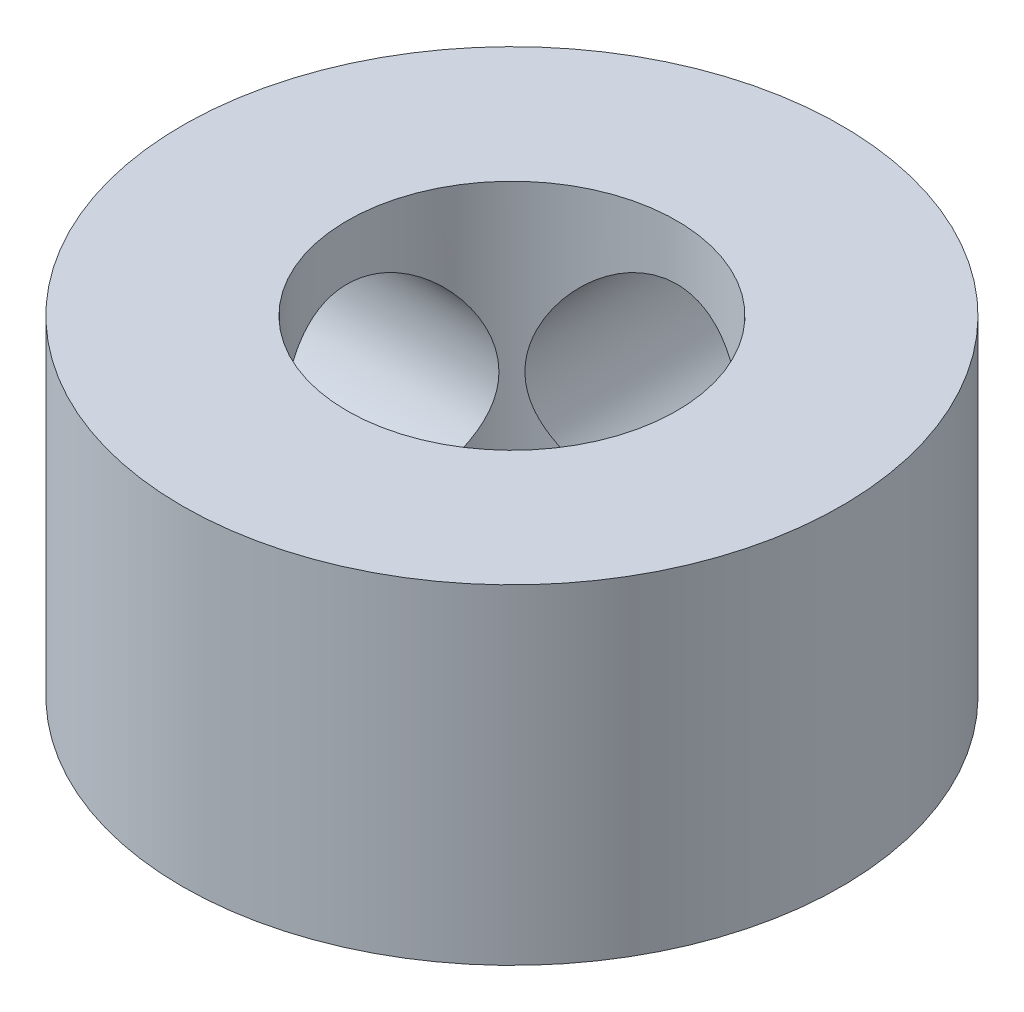
ISO-10303-21;
HEADER;
FILE_DESCRIPTION(('STEP AP214'),'2;1');
FILE_NAME('part.step','',(''),(''),'','','');
FILE_SCHEMA(('AUTOMOTIVE_DESIGN { 1 0 10303 214 1 1 1 1 }'));
ENDSEC;
DATA;
#1=APPLICATION_CONTEXT('core data for automotive mechanical design processes');
#2=APPLICATION_PROTOCOL_DEFINITION('international standard','automotive_design',2000,#1);
#3=PRODUCT_CONTEXT('',#1,'mechanical');
#4=PRODUCT('Part','Part','',(#3));
#5=PRODUCT_RELATED_PRODUCT_CATEGORY('part','',(#4));
#6=PRODUCT_DEFINITION_FORMATION('','',#4);
#7=PRODUCT_DEFINITION_CONTEXT('part definition',#1,'design');
#8=PRODUCT_DEFINITION('design','',#6,#7);
#9=PRODUCT_DEFINITION_SHAPE('','',#8);
#10=(LENGTH_UNIT() NAMED_UNIT(*) SI_UNIT(.MILLI.,.METRE.));
#11=(NAMED_UNIT(*) PLANE_ANGLE_UNIT() SI_UNIT($,.RADIAN.));
#12=(NAMED_UNIT(*) SI_UNIT($,.STERADIAN.) SOLID_ANGLE_UNIT());
#13=UNCERTAINTY_MEASURE_WITH_UNIT(LENGTH_MEASURE(1.E-05),#10,'distance_accuracy_value','');
#14=(GEOMETRIC_REPRESENTATION_CONTEXT(3) GLOBAL_UNCERTAINTY_ASSIGNED_CONTEXT((#13)) GLOBAL_UNIT_ASSIGNED_CONTEXT((#10,
#11,#12)) REPRESENTATION_CONTEXT('',''));
#15=CARTESIAN_POINT('',(0.,0.,0.));
#16=DIRECTION('',(0.,0.,1.));
#17=DIRECTION('',(1.,0.,0.));
#18=AXIS2_PLACEMENT_3D('',#15,#16,#17);
#19=CARTESIAN_POINT('',(0.,6.,0.));
#20=DIRECTION('',(0.,1.,0.));
#21=DIRECTION('',(0.,0.,1.));
#22=AXIS2_PLACEMENT_3D('',#19,#20,#21);
#23=PLANE('',#22);
#24=CARTESIAN_POINT('',(0.,6.,0.));
#25=DIRECTION('',(0.,1.,0.));
#26=DIRECTION('',(0.,0.,1.));
#27=AXIS2_PLACEMENT_3D('',#24,#25,#26);
#28=CIRCLE('',#27,6.);
#29=CARTESIAN_POINT('',(0.,6.,6.));
#30=VERTEX_POINT('',#29);
#31=EDGE_CURVE('E10',#30,#30,#28,.T.);
#32=ORIENTED_EDGE('',*,*,#31,.T.);
#33=EDGE_LOOP('',(#32));
#34=FACE_BOUND('',#33,.T.);
#35=CARTESIAN_POINT('',(0.,6.,0.));
#36=DIRECTION('',(0.,1.,0.));
#37=DIRECTION('',(0.,0.,1.));
#38=AXIS2_PLACEMENT_3D('',#35,#36,#37);
#39=CIRCLE('',#38,3.);
#40=CARTESIAN_POINT('',(0.,6.,3.));
#41=VERTEX_POINT('',#40);
#42=EDGE_CURVE('E60',#41,#41,#39,.T.);
#43=ORIENTED_EDGE('',*,*,#42,.F.);
#44=EDGE_LOOP('',(#43));
#45=FACE_BOUND('',#44,.T.);
#46=ADVANCED_FACE('F36',(#34,#45),#23,.T.);
#47=CARTESIAN_POINT('',(0.,0.,0.));
#48=DIRECTION('',(0.,1.,0.));
#49=DIRECTION('',(0.,0.,1.));
#50=AXIS2_PLACEMENT_3D('',#47,#48,#49);
#51=PLANE('',#50);
#52=CARTESIAN_POINT('',(0.,0.,0.));
#53=DIRECTION('',(0.,1.,0.));
#54=DIRECTION('',(0.,0.,1.));
#55=AXIS2_PLACEMENT_3D('',#52,#53,#54);
#56=CIRCLE('',#55,6.);
#57=CARTESIAN_POINT('',(0.,0.,6.));
#58=VERTEX_POINT('',#57);
#59=EDGE_CURVE('E55',#58,#58,#56,.T.);
#60=ORIENTED_EDGE('',*,*,#59,.F.);
#61=EDGE_LOOP('',(#60));
#62=FACE_BOUND('',#61,.T.);
#63=CARTESIAN_POINT('',(0.,0.,0.));
#64=DIRECTION('',(0.,1.,0.));
#65=DIRECTION('',(0.,0.,1.));
#66=AXIS2_PLACEMENT_3D('',#63,#64,#65);
#67=CIRCLE('',#66,3.);
#68=CARTESIAN_POINT('',(0.,0.,3.));
#69=VERTEX_POINT('',#68);
#70=EDGE_CURVE('E58',#69,#69,#67,.T.);
#71=ORIENTED_EDGE('',*,*,#70,.T.);
#72=EDGE_LOOP('',(#71));
#73=FACE_BOUND('',#72,.T.);
#74=ADVANCED_FACE('F92',(#62,#73),#51,.F.);
#75=CARTESIAN_POINT('',(0.,6.,0.));
#76=DIRECTION('',(0.,-1.,0.));
#77=DIRECTION('',(0.,0.,-1.));
#78=AXIS2_PLACEMENT_3D('',#75,#76,#77);
#79=CYLINDRICAL_SURFACE('',#78,6.);
#80=CARTESIAN_POINT('',(-5.65685424949238,3.,-2.));
#81=CARTESIAN_POINT('',(-5.65685389060868,3.10893634967214,-2.00000051589543));
#82=CARTESIAN_POINT('',(-5.66003538581715,3.21786959964719,-1.99106956737105));
#83=CARTESIAN_POINT('',(-5.6723514816251,3.4325088419885,-1.95570226337762));
#84=CARTESIAN_POINT('',(-5.68148706284377,3.53821429974494,-1.92926302433679));
#85=CARTESIAN_POINT('',(-5.70456407377583,3.74325378599458,-1.85991097136981));
#86=CARTESIAN_POINT('',(-5.71849607942644,3.84259985888543,-1.81703044280649));
#87=CARTESIAN_POINT('',(-5.74958244020649,4.03272009709592,-1.71612325688276));
#88=CARTESIAN_POINT('',(-5.76673750607225,4.12349236510726,-1.65809325772037));
#89=CARTESIAN_POINT('',(-5.80308978814946,4.29743992467663,-1.52610229288576));
#90=CARTESIAN_POINT('',(-5.82233789689288,4.38023085734345,-1.45164868275584));
#91=CARTESIAN_POINT('',(-5.86027729602006,4.53241360244928,-1.28997533442879));
#92=CARTESIAN_POINT('',(-5.87896849657923,4.60180326316474,-1.20275355010475));
#93=CARTESIAN_POINT('',(-5.91427733843598,4.72695779465919,-1.01520901593002));
#94=CARTESIAN_POINT('',(-5.93082815403211,4.78231994123592,-0.914603822449052));
#95=CARTESIAN_POINT('',(-5.95939173541966,4.87518317025502,-0.704862445974949));
#96=CARTESIAN_POINT('',(-5.97140572406004,4.91268906635381,-0.595728571374425));
#97=CARTESIAN_POINT('',(-5.98918150863813,4.96747170926479,-0.37605763486699));
#98=CARTESIAN_POINT('',(-5.99514629555118,4.98540689251401,-0.265701509705938));
#99=CARTESIAN_POINT('',(-6.00087216436496,5.00263258672132,-0.0433957496481797));
#100=CARTESIAN_POINT('',(-6.00063484525791,5.00192790330482,0.0685534670877919));
#101=CARTESIAN_POINT('',(-5.99412079237463,4.98231149086794,0.286207030387629));
#102=CARTESIAN_POINT('',(-5.98808129510235,4.96411494305102,0.391984097183312));
#103=CARTESIAN_POINT('',(-5.97093934679463,4.91121403803905,0.598886877644343));
#104=CARTESIAN_POINT('',(-5.95983655262364,4.87650856204035,0.700012275558431));
#105=CARTESIAN_POINT('',(-5.93351340586449,4.79115736538788,0.896304949683945));
#106=CARTESIAN_POINT('',(-5.91824085048031,4.74030812290698,0.991376441937689));
#107=CARTESIAN_POINT('',(-5.88516786077838,4.62428058910269,1.17184865105464));
#108=CARTESIAN_POINT('',(-5.86736672402934,4.55909831334474,1.25724666877068));
#109=CARTESIAN_POINT('',(-5.83012383699793,4.4126512130806,1.42020173310261));
#110=CARTESIAN_POINT('',(-5.81064430337755,4.33077368431704,1.49720031413054));
#111=CARTESIAN_POINT('',(-5.77294670497801,4.15510254854676,1.63655451919635));
#112=CARTESIAN_POINT('',(-5.75472883491231,4.06130710854391,1.69890788656309));
#113=CARTESIAN_POINT('',(-5.72141050242225,3.86269274879312,1.80797491007149));
#114=CARTESIAN_POINT('',(-5.70635818569496,3.75773573736445,1.85445292724268));
#115=CARTESIAN_POINT('',(-5.6816330164877,3.54085721157117,1.92888638653867));
#116=CARTESIAN_POINT('',(-5.67195790974185,3.42893863758751,1.95684959149499));
#117=CARTESIAN_POINT('',(-5.6595927263117,3.20672328917685,1.99232256419504));
#118=CARTESIAN_POINT('',(-5.65660720637512,3.09658115050269,2.00069819101526));
#119=CARTESIAN_POINT('',(-5.65713344118369,2.87644770177179,1.99921087781944));
#120=CARTESIAN_POINT('',(-5.66064401583629,2.76645636795202,1.98935125045353));
#121=CARTESIAN_POINT('',(-5.67347236180599,2.55368606857618,1.95245130310462));
#122=CARTESIAN_POINT('',(-5.68258650881681,2.45078913969832,1.92601278796137));
#123=CARTESIAN_POINT('',(-5.70537107342046,2.25091278752163,1.85742772512093));
#124=CARTESIAN_POINT('',(-5.71904229869679,2.15393441681844,1.81527839272684));
#125=CARTESIAN_POINT('',(-5.74993755191574,1.965239158306,1.71494868147787));
#126=CARTESIAN_POINT('',(-5.76726051331257,1.8737867147164,1.65630223671699));
#127=CARTESIAN_POINT('',(-5.8033153746193,1.70170789523256,1.52517126111512));
#128=CARTESIAN_POINT('',(-5.82204768887589,1.62108472267756,1.45268265099756));
#129=CARTESIAN_POINT('',(-5.85990077275698,1.46894403181872,1.29178341180065));
#130=CARTESIAN_POINT('',(-5.87899687155793,1.3980512199623,1.2027745410933));
#131=CARTESIAN_POINT('',(-5.91453703226218,1.27216771530391,1.01365458280051));
#132=CARTESIAN_POINT('',(-5.9309811883539,1.21717645767515,0.913543889729105));
#133=CARTESIAN_POINT('',(-5.95928811621206,1.12515979027657,0.705559724864591));
#134=CARTESIAN_POINT('',(-5.97118060009062,1.08801744570387,0.597742246642393));
#135=CARTESIAN_POINT('',(-5.98917221675549,1.03254451587979,0.376916931692033));
#136=CARTESIAN_POINT('',(-5.99527344068038,1.01420714023899,0.263910983907779));
#137=CARTESIAN_POINT('',(-6.00083726472513,0.997475844788715,0.0416306717200819));
#138=CARTESIAN_POINT('',(-6.00059840178878,0.998185092135245,-0.067569447840037));
#139=CARTESIAN_POINT('',(-5.99424393038796,1.01731461629282,-0.284222290000348));
#140=CARTESIAN_POINT('',(-5.98812879867152,1.03573345630554,-0.391675153638113));
#141=CARTESIAN_POINT('',(-5.97081829908825,1.08916446915192,-0.600084238864118));
#142=CARTESIAN_POINT('',(-5.95970516722297,1.12390843070587,-0.701116541825578));
#143=CARTESIAN_POINT('',(-5.9335432140899,1.20875506219431,-0.895956701879591));
#144=CARTESIAN_POINT('',(-5.91849368096033,1.25886051039403,-0.989763248284865));
#145=CARTESIAN_POINT('',(-5.88531737655762,1.37513902420401,-1.17126803261757));
#146=CARTESIAN_POINT('',(-5.86709744983853,1.44183737076328,-1.25861250311521));
#147=CARTESIAN_POINT('',(-5.82985977583759,1.58851478231239,-1.42116205254485));
#148=CARTESIAN_POINT('',(-5.81084177546194,1.66849808452545,-1.49636324324918));
#149=CARTESIAN_POINT('',(-5.77326559651196,1.8432187111739,-1.63548361766624));
#150=CARTESIAN_POINT('',(-5.75475455977261,1.93841102195328,-1.6988459319958));
#151=CARTESIAN_POINT('',(-5.72120386646031,2.13866885380556,-1.80862868660223));
#152=CARTESIAN_POINT('',(-5.70616330322499,2.24373178605933,-1.85505355363895));
#153=CARTESIAN_POINT('',(-5.68202668413029,2.45592364803126,-1.92768765640833));
#154=CARTESIAN_POINT('',(-5.67269265714365,2.56274452705073,-1.95471581829904));
#155=CARTESIAN_POINT('',(-5.66010767079037,2.7797121009334,-1.99086864029853));
#156=CARTESIAN_POINT('',(-5.65685461234922,2.88985763482142,-1.99999947839319));
#157=CARTESIAN_POINT('',(-5.65685424949238,3.,-2.));
#158=B_SPLINE_CURVE_WITH_KNOTS('',3,(#80,#81,#82,#83,#84,#85,#86,#87,#88,#89,#90,#91,#92,#93,
#94,#95,#96,#97,#98,#99,#100,#101,#102,#103,#104,#105,#106,#107,#108,#109,#110,#111,#112,#113,
#114,#115,#116,#117,#118,#119,#120,#121,#122,#123,#124,#125,#126,#127,#128,#129,#130,#131,#132,
#133,#134,#135,#136,#137,#138,#139,#140,#141,#142,#143,#144,#145,#146,#147,#148,#149,#150,#151,
#152,#153,#154,#155,#156,#157),.UNSPECIFIED.,.T.,.F.,(4,2,2,2,2,2,2,2,2,2,2,2,2,2,2,2,2,2,2,2,2,
2,2,2,2,2,2,2,2,2,2,2,2,2,2,2,2,2,4),(0.,0.326401169598712,0.652856110030327,0.978673255001655,
1.30456233237088,1.64202674855136,1.97954530343976,2.32587012287314,2.67210152773578,
3.00628637529868,3.34038506604655,3.66138009651138,3.98239688378473,4.3076330972067,
4.63295983748044,4.97360348727835,5.31429959224212,5.65985279686111,6.00526102713231,
6.33508582728879,6.66485071674467,6.98328791537552,7.30178158293891,7.6303771547143,
7.95906971324255,8.30357616342185,8.64807037515065,8.99027582381703,9.33235766008313,
9.65836169355271,9.98433928019562,10.3051391208086,10.6259970152649,10.9587103904127,
11.2915300886526,11.6373780547229,11.9831355653373,12.3132642432538,12.6432789438093),.UNSPECIFIED.);
#159=CARTESIAN_POINT('',(-5.65685424949238,3.,-2.));
#160=VERTEX_POINT('',#159);
#161=EDGE_CURVE('E68',#160,#160,#158,.T.);
#162=ORIENTED_EDGE('',*,*,#161,.T.);
#163=EDGE_LOOP('',(#162));
#164=FACE_BOUND('',#163,.T.);
#165=CARTESIAN_POINT('',(0.,5.,-6.));
#166=CARTESIAN_POINT('',(-0.109126725773446,5.00000050746328,-6.00000030601888));
#167=CARTESIAN_POINT('',(-0.2182503890771,4.99103946774557,-5.9969953901509));
#168=CARTESIAN_POINT('',(-0.433283521745945,4.95554178236556,-5.98530420406562));
#169=CARTESIAN_POINT('',(-0.539192656237636,4.92900331210216,-5.97661734404305));
#170=CARTESIAN_POINT('',(-0.744665579003552,4.8593615132319,-5.95450615812885));
#171=CARTESIAN_POINT('',(-0.844239651772069,4.81628587508146,-5.94108975461707));
#172=CARTESIAN_POINT('',(-1.03474987361065,4.7149176543233,-5.91088891434684));
#173=CARTESIAN_POINT('',(-1.12568431391741,4.6566220699948,-5.89410381335556));
#174=CARTESIAN_POINT('',(-1.29948335004453,4.52434839028249,-5.8582818888601));
#175=CARTESIAN_POINT('',(-1.38200740059662,4.44993753147901,-5.8391911292757));
#176=CARTESIAN_POINT('',(-1.53366538540417,4.28846569058687,-5.80120629566243));
#177=CARTESIAN_POINT('',(-1.60279637097892,4.20140193014297,-5.78231226581098));
#178=CARTESIAN_POINT('',(-1.72764988445572,4.01402976960708,-5.74626664954548));
#179=CARTESIAN_POINT('',(-1.78292971644206,3.91341252053575,-5.72918078551376));
#180=CARTESIAN_POINT('',(-1.87563774775544,3.70364781108291,-5.69950610837202));
#181=CARTESIAN_POINT('',(-1.91307139477353,3.59450296567451,-5.68691592321491));
#182=CARTESIAN_POINT('',(-1.96774692301833,3.37465355700658,-5.66822606538755));
#183=CARTESIAN_POINT('',(-1.98562689654354,3.26412558302187,-5.66192191539223));
#184=CARTESIAN_POINT('',(-2.00268224666895,3.04147249168824,-5.65591313259015));
#185=CARTESIAN_POINT('',(-2.00186340320944,2.92934787858162,-5.6562064604546));
#186=CARTESIAN_POINT('',(-1.98203980740684,2.71212673911196,-5.6631803001636));
#187=CARTESIAN_POINT('',(-1.96386782633399,2.60694319416196,-5.66956831735066));
#188=CARTESIAN_POINT('',(-1.91121232569883,2.40121316078633,-5.68753315449102));
#189=CARTESIAN_POINT('',(-1.87672685318374,2.30066722912986,-5.69911059568215));
#190=CARTESIAN_POINT('',(-1.79187811612042,2.10517450081704,-5.72635822262498));
#191=CARTESIAN_POINT('',(-1.74126809741452,2.01034394906095,-5.74209131586235));
#192=CARTESIAN_POINT('',(-1.62577821260628,1.83025818344055,-5.77585117151453));
#193=CARTESIAN_POINT('',(-1.56089422472801,1.74500574613324,-5.79387859580927));
#194=CARTESIAN_POINT('',(-1.41469866536447,1.58181680367845,-5.83134658335482));
#195=CARTESIAN_POINT('',(-1.33270630015262,1.50449461098186,-5.85081178709686));
#196=CARTESIAN_POINT('',(-1.15667913994013,1.3645374666732,-5.88813876774073));
#197=CARTESIAN_POINT('',(-1.06264319132163,1.30190392367101,-5.90600039076135));
#198=CARTESIAN_POINT('',(-0.863895226092534,1.19260739952986,-5.93834215875587));
#199=CARTESIAN_POINT('',(-0.759086552832672,1.14610901731854,-5.95278700016078));
#200=CARTESIAN_POINT('',(-0.542538166729014,1.07159365208858,-5.9764113428887));
#201=CARTESIAN_POINT('',(-0.430800876309906,1.04357024915312,-5.98559267309759));
#202=CARTESIAN_POINT('',(-0.208767659058607,1.00788866795528,-5.99735254142881));
#203=CARTESIAN_POINT('',(-0.098619199729691,0.999400381654497,-6.00020003667456));
#204=CARTESIAN_POINT('',(0.121550139920476,1.00066534719694,-5.99977805389655));
#205=CARTESIAN_POINT('',(0.231571038639302,1.01041551995975,-5.99650960838725));
#206=CARTESIAN_POINT('',(0.445039732608512,1.04722381547192,-5.98440049434209));
#207=CARTESIAN_POINT('',(0.548585613669688,1.07377241209899,-5.97572397422385));
#208=CARTESIAN_POINT('',(0.749711917159148,1.14278688893346,-5.9538369366014));
#209=CARTESIAN_POINT('',(0.847291577017214,1.18525479893557,-5.9406258409335));
#210=CARTESIAN_POINT('',(1.03657659278655,1.28614086368157,-5.91057862574579));
#211=CARTESIAN_POINT('',(1.12805991843429,1.34494918656634,-5.89365629511572));
#212=CARTESIAN_POINT('',(1.30012966027117,1.47638830002697,-5.85810507832525));
#213=CARTESIAN_POINT('',(1.38071273559115,1.54902331206353,-5.83947567187655));
#214=CARTESIAN_POINT('',(1.5325050156126,1.70995750201318,-5.8015369596089));
#215=CARTESIAN_POINT('',(1.60312193849154,1.79881845385372,-5.78223522174856));
#216=CARTESIAN_POINT('',(1.72851504464715,1.98754313562177,-5.74599946589417));
#217=CARTESIAN_POINT('',(1.78329109586203,2.08740695726815,-5.72906546764005));
#218=CARTESIAN_POINT('',(1.87519386083272,2.29534603057979,-5.69964783582767));
#219=CARTESIAN_POINT('',(1.91235626433004,2.40340415833753,-5.68715521585958));
#220=CARTESIAN_POINT('',(1.96778933351871,2.62475730008826,-5.66821664612899));
#221=CARTESIAN_POINT('',(1.98606850990788,2.7380499308087,-5.66176797247279));
#222=CARTESIAN_POINT('',(2.00255256495468,2.96039419208183,-5.65595717748354));
#223=CARTESIAN_POINT('',(2.0017405146168,3.06936468057365,-5.6562480051483));
#224=CARTESIAN_POINT('',(1.98248458689739,3.28553014984413,-5.66302539647735));
#225=CARTESIAN_POINT('',(1.96404175891717,3.39272523591018,-5.66951159138723));
#226=CARTESIAN_POINT('',(1.91074362625869,3.60027132600495,-5.68769048609783));
#227=CARTESIAN_POINT('',(1.87620669203103,3.70071365000899,-5.69928196044955));
#228=CARTESIAN_POINT('',(1.79195873151949,3.89445481387654,-5.72632797636937));
#229=CARTESIAN_POINT('',(1.74224433710761,3.98775206237601,-5.74178337526786));
#230=CARTESIAN_POINT('',(1.62652138516686,4.16896733984582,-5.77565658452093));
#231=CARTESIAN_POINT('',(1.55989648552916,4.25647300379677,-5.79417423284274));
#232=CARTESIAN_POINT('',(1.4132857662713,4.4193796267684,-5.83166712566506));
#233=CARTESIAN_POINT('',(1.33329616890296,4.49477715137615,-5.85064249824745));
#234=CARTESIAN_POINT('',(1.15848311384138,4.63428882457836,-5.88780061051088));
#235=CARTESIAN_POINT('',(1.06320302699946,4.697848695502,-5.90592363602513));
#236=CARTESIAN_POINT('',(0.862714714813248,4.80798085770129,-5.93851982345224));
#237=CARTESIAN_POINT('',(0.757509036264697,4.85455749184408,-5.9529939181586));
#238=CARTESIAN_POINT('',(0.544987294401951,4.92744326497734,-5.97611030137084));
#239=CARTESIAN_POINT('',(0.437975515352817,4.95456493252675,-5.98498424845045));
#240=CARTESIAN_POINT('',(0.220640832020494,4.99084056135425,-5.99692814128444));
#241=CARTESIAN_POINT('',(0.110318851137493,4.99999948699307,-5.9999996906381));
#242=CARTESIAN_POINT('',(0.,5.,-6.));
#243=B_SPLINE_CURVE_WITH_KNOTS('',3,(#165,#166,#167,#168,#169,#170,#171,#172,#173,#174,#175,
#176,#177,#178,#179,#180,#181,#182,#183,#184,#185,#186,#187,#188,#189,#190,#191,#192,#193,#194,
#195,#196,#197,#198,#199,#200,#201,#202,#203,#204,#205,#206,#207,#208,#209,#210,#211,#212,#213,
#214,#215,#216,#217,#218,#219,#220,#221,#222,#223,#224,#225,#226,#227,#228,#229,#230,#231,#232,
#233,#234,#235,#236,#237,#238,#239,#240,#241,#242),.UNSPECIFIED.,.T.,.F.,(4,2,2,2,2,2,2,2,2,2,2,
2,2,2,2,2,2,2,2,2,2,2,2,2,2,2,2,2,2,2,2,2,2,2,2,2,2,2,4),(0.,0.326974212052022,
0.653982370535042,0.980445345740548,1.3069727555982,1.64369368565512,1.98048866575061,
2.32696769646941,2.67334089385667,3.0080385148368,3.34263267974971,3.6619365310256,
3.98127861710964,4.30576342310261,4.63034205116414,4.97186611622734,5.31342291933236,
5.65836811300715,6.00319337754417,6.33307166350339,6.66289426328353,6.98316315956427,
7.30347290568208,7.63220799687473,7.96104361643782,8.30482045761504,8.64860016469993,
8.99168027653541,9.3346056941168,9.65991332128517,9.9852015870275,10.3043117416084,
10.6234927635196,10.9566013338361,11.2898042224756,11.635993216702,11.9820936230491,
12.3127311674763,12.6432773207628),.UNSPECIFIED.);
#244=CARTESIAN_POINT('',(0.,5.,-6.));
#245=VERTEX_POINT('',#244);
#246=EDGE_CURVE('E69',#245,#245,#243,.T.);
#247=ORIENTED_EDGE('',*,*,#246,.T.);
#248=EDGE_LOOP('',(#247));
#249=FACE_BOUND('',#248,.T.);
#250=ORIENTED_EDGE('',*,*,#31,.F.);
#251=EDGE_LOOP('',(#250));
#252=FACE_BOUND('',#251,.T.);
#253=ORIENTED_EDGE('',*,*,#59,.T.);
#254=EDGE_LOOP('',(#253));
#255=FACE_BOUND('',#254,.T.);
#256=ADVANCED_FACE('F37',(#164,#249,#252,#255),#79,.T.);
#257=CARTESIAN_POINT('',(0.,6.,0.));
#258=DIRECTION('',(0.,-1.,0.));
#259=DIRECTION('',(0.,0.,-1.));
#260=AXIS2_PLACEMENT_3D('',#257,#258,#259);
#261=CYLINDRICAL_SURFACE('',#260,3.);
#262=CARTESIAN_POINT('',(-2.23606797749979,3.,-2.));
#263=CARTESIAN_POINT('',(-2.23607753462817,3.09762831086862,-1.99999453997731));
#264=CARTESIAN_POINT('',(-2.24258071047442,3.1952907537088,-1.99278992503664));
#265=CARTESIAN_POINT('',(-2.26731972501617,3.38711991165081,-1.96458268317731));
#266=CARTESIAN_POINT('',(-2.2855766081271,3.48128003552957,-1.94355530587862));
#267=CARTESIAN_POINT('',(-2.3305658582557,3.66273544187768,-1.88935861676632));
#268=CARTESIAN_POINT('',(-2.35721561794601,3.75008769673766,-1.85630718014214));
#269=CARTESIAN_POINT('',(-2.41584094681825,3.91786583234666,-1.77934008393538));
#270=CARTESIAN_POINT('',(-2.44781762158831,3.99829026997647,-1.73542216812163));
#271=CARTESIAN_POINT('',(-2.51946072932026,4.16364688761691,-1.63002410007714));
#272=CARTESIAN_POINT('',(-2.55954936090364,4.2473321177172,-1.56687435451732));
#273=CARTESIAN_POINT('',(-2.63944827308083,4.40400270887428,-1.4281921974068));
#274=CARTESIAN_POINT('',(-2.67925824297985,4.47697752165853,-1.3526477317708));
#275=CARTESIAN_POINT('',(-2.76088818523747,4.62064365878166,-1.17815690494296));
#276=CARTESIAN_POINT('',(-2.80216785846923,4.68948251177567,-1.07740643965819));
#277=CARTESIAN_POINT('',(-2.87558484482764,4.80864209549007,-0.862470964212233));
#278=CARTESIAN_POINT('',(-2.90773236231037,4.85898351403119,-0.748301152321705));
#279=CARTESIAN_POINT('',(-2.95599907464725,4.93355640101745,-0.523249073480003));
#280=CARTESIAN_POINT('',(-2.97351175615867,4.96008334449556,-0.413434725181416));
#281=CARTESIAN_POINT('',(-2.99609745461921,4.99418448928365,-0.189695448729862));
#282=CARTESIAN_POINT('',(-3.00118613762359,5.00178255922544,-0.0757758812858255));
#283=CARTESIAN_POINT('',(-2.99855361722953,4.99782755005095,0.134147050232329));
#284=CARTESIAN_POINT('',(-2.99266264910127,4.98901094868294,0.230240638008752));
#285=CARTESIAN_POINT('',(-2.9720818279002,4.95790894864109,0.419238633271014));
#286=CARTESIAN_POINT('',(-2.95739133313102,4.93562256769646,0.512142807649723));
#287=CARTESIAN_POINT('',(-2.92052091703736,4.87880431520542,0.692077937671168));
#288=CARTESIAN_POINT('',(-2.89837077982679,4.84432111480144,0.779130623845961));
#289=CARTESIAN_POINT('',(-2.84821104476287,4.76444635704718,0.946209150653555));
#290=CARTESIAN_POINT('',(-2.82020037745161,4.71905280849849,1.0262337049694));
#291=CARTESIAN_POINT('',(-2.75618058450702,4.61202126254011,1.18828429196344));
#292=CARTESIAN_POINT('',(-2.71960408792025,4.54903247664721,1.26919148099708));
#293=CARTESIAN_POINT('',(-2.64400601826998,4.41210132051968,1.41998807498305));
#294=CARTESIAN_POINT('',(-2.60498072815232,4.33814205406619,1.48986013519457));
#295=CARTESIAN_POINT('',(-2.52150044944152,4.16803678978671,1.62772235326165));
#296=CARTESIAN_POINT('',(-2.47714320008932,4.07022892028551,1.69373593126354));
#297=CARTESIAN_POINT('',(-2.39475610831096,3.86249016077929,1.80834874945482));
#298=CARTESIAN_POINT('',(-2.3567157153489,3.7525800055861,1.85697718654898));
#299=CARTESIAN_POINT('',(-2.30262870306889,3.5552809379269,1.92332724567776));
#300=CARTESIAN_POINT('',(-2.28340364577668,3.47040662994313,1.94590791747533));
#301=CARTESIAN_POINT('',(-2.25409039789612,3.29696051018316,1.97979555580014));
#302=CARTESIAN_POINT('',(-2.24398636782354,3.20839538882738,1.99112206964395));
#303=CARTESIAN_POINT('',(-2.23447556987372,3.02955701355851,2.00179400148877));
#304=CARTESIAN_POINT('',(-2.2351153386647,2.93927802147988,2.00108729753098));
#305=CARTESIAN_POINT('',(-2.24709880368953,2.76031616604496,1.98761629716365));
#306=CARTESIAN_POINT('',(-2.25845117648851,2.67163465589261,1.97484222690381));
#307=CARTESIAN_POINT('',(-2.28927977500747,2.50261058245016,1.93899811187046));
#308=CARTESIAN_POINT('',(-2.30833187069749,2.42207229099742,1.91646174529973));
#309=CARTESIAN_POINT('',(-2.35229958533651,2.2658737639497,1.86223041628513));
#310=CARTESIAN_POINT('',(-2.3772171729463,2.19021517703699,1.83053237805351));
#311=CARTESIAN_POINT('',(-2.43611483596194,2.02979799615248,1.75163346599563));
#312=CARTESIAN_POINT('',(-2.47091081434317,1.9462431884573,1.70260028818246));
#313=CARTESIAN_POINT('',(-2.54262514806634,1.78758319738271,1.59352731501438));
#314=CARTESIAN_POINT('',(-2.57954604947543,1.71248848325755,1.53347411883827));
#315=CARTESIAN_POINT('',(-2.66075678321007,1.55603765253246,1.38876657712435));
#316=CARTESIAN_POINT('',(-2.70489452138573,1.47689715175168,1.30160386514207));
#317=CARTESIAN_POINT('',(-2.78775581841638,1.33418331705971,1.11309948866219));
#318=CARTESIAN_POINT('',(-2.82648414789457,1.27059622874327,1.011770477457));
#319=CARTESIAN_POINT('',(-2.88790821242222,1.17210826108241,0.817487474821795));
#320=CARTESIAN_POINT('',(-2.91225458111008,1.13404349555963,0.72666236488632));
#321=CARTESIAN_POINT('',(-2.95278707867041,1.07139280567956,0.538757079020514));
#322=CARTESIAN_POINT('',(-2.96898009871993,1.04679549714023,0.441682263858768));
#323=CARTESIAN_POINT('',(-2.99178364026746,1.01230303616125,0.243369392303442));
#324=CARTESIAN_POINT('',(-2.99835150856533,1.00247332049332,0.142114836924318));
#325=CARTESIAN_POINT('',(-3.00109821029056,0.998352148582895,-0.0608555465807325));
#326=CARTESIAN_POINT('',(-2.99727800938901,1.00405924804382,-0.162571330953448));
#327=CARTESIAN_POINT('',(-2.98029555977323,1.0296594890047,-0.355757532528107));
#328=CARTESIAN_POINT('',(-2.96783277209856,1.04849098486181,-0.447435143070532));
#329=CARTESIAN_POINT('',(-2.93536106206933,1.0982380094309,-0.626018422997064));
#330=CARTESIAN_POINT('',(-2.91535096747103,1.12915541534726,-0.712923348686891));
#331=CARTESIAN_POINT('',(-2.86791765486194,1.20393870488403,-0.885147296608352));
#332=CARTESIAN_POINT('',(-2.84013248946338,1.24845030749508,-0.970083589200266));
#333=CARTESIAN_POINT('',(-2.77975408235472,1.34815064462598,-1.13155266268318));
#334=CARTESIAN_POINT('',(-2.74715796645263,1.403345767952,-1.20808037205002));
#335=CARTESIAN_POINT('',(-2.67392931472394,1.53262890233631,-1.36329422201402));
#336=CARTESIAN_POINT('',(-2.6328391387737,1.60832302367404,-1.44042679526091));
#337=CARTESIAN_POINT('',(-2.55053357649486,1.77111354154584,-1.58160022281596));
#338=CARTESIAN_POINT('',(-2.50931811970154,1.85821838883409,-1.64563128323923));
#339=CARTESIAN_POINT('',(-2.43384213590298,2.03586759075529,-1.75513253518411));
#340=CARTESIAN_POINT('',(-2.39929086741904,2.12564180995034,-1.8016464689721));
#341=CARTESIAN_POINT('',(-2.33747501591022,2.31328444899316,-1.88115802340272));
#342=CARTESIAN_POINT('',(-2.31019631295305,2.41113669386215,-1.91418190281333));
#343=CARTESIAN_POINT('',(-2.27191051929539,2.59077146842455,-1.95936262470908));
#344=CARTESIAN_POINT('',(-2.25863695410151,2.6713082367903,-1.97452228373248));
#345=CARTESIAN_POINT('',(-2.24071519216009,2.83455640050454,-1.99483915818926));
#346=CARTESIAN_POINT('',(-2.23605987841475,2.91726594426058,-2.00000462703715));
#347=CARTESIAN_POINT('',(-2.23606797749979,3.,-2.));
#348=B_SPLINE_CURVE_WITH_KNOTS('',3,(#262,#263,#264,#265,#266,#267,#268,#269,#270,#271,#272,
#273,#274,#275,#276,#277,#278,#279,#280,#281,#282,#283,#284,#285,#286,#287,#288,#289,#290,#291,
#292,#293,#294,#295,#296,#297,#298,#299,#300,#301,#302,#303,#304,#305,#306,#307,#308,#309,#310,
#311,#312,#313,#314,#315,#316,#317,#318,#319,#320,#321,#322,#323,#324,#325,#326,#327,#328,#329,
#330,#331,#332,#333,#334,#335,#336,#337,#338,#339,#340,#341,#342,#343,#344,#345,#346,#347),
.UNSPECIFIED.,.T.,.F.,(4,2,2,2,2,2,2,2,2,2,2,2,2,2,2,2,2,2,2,2,2,2,2,2,2,2,2,2,2,2,2,2,2,2,2,2,
2,2,2,2,2,2,4),(0.,0.292506930722153,0.585539042259288,0.875772651216274,1.16606657266549,
1.50154677068638,1.83735518436275,2.22167031006289,2.6055542938858,2.94637482063579,
3.28676536688298,3.57539534955742,3.86404638283746,4.15155831973191,4.43912276903,
4.76447525946635,5.09033414796638,5.46678703504944,5.84260469743948,6.11126090401324,
6.37944966235486,6.64880037638036,6.91836943570598,7.17476451706936,7.43124577644957,
7.73899230052352,8.04711556801509,8.42254684520963,8.7976449057258,9.10070580611698,
9.40351012888472,9.70765229266164,10.0117661844615,10.2937678224973,10.5758132789284,
10.874178629859,11.1727229593109,11.5182220628451,11.863978504186,12.1833412579672,
12.5020793664923,12.7501661630426,12.9980479966543),.UNSPECIFIED.);
#349=CARTESIAN_POINT('',(-2.23606797749979,3.,-2.));
#350=VERTEX_POINT('',#349);
#351=EDGE_CURVE('E43',#350,#350,#348,.T.);
#352=ORIENTED_EDGE('',*,*,#351,.F.);
#353=EDGE_LOOP('',(#352));
#354=FACE_BOUND('',#353,.T.);
#355=CARTESIAN_POINT('',(0.,5.,-3.));
#356=CARTESIAN_POINT('',(-0.100484716668078,5.00000054963247,-3.0000004164484));
#357=CARTESIAN_POINT('',(-0.200969087132901,4.9923860300445,-2.99490802753388));
#358=CARTESIAN_POINT('',(-0.398733058031681,4.96240313589434,-2.97504652423809));
#359=CARTESIAN_POINT('',(-0.496011113955007,4.9400277568767,-2.96027281581235));
#360=CARTESIAN_POINT('',(-0.684212307854249,4.88189228267516,-2.92250482404708));
#361=CARTESIAN_POINT('',(-0.775162872657554,4.84619485999206,-2.89954905493315));
#362=CARTESIAN_POINT('',(-0.94941529099726,4.7629366367285,-2.8472613787744));
#363=CARTESIAN_POINT('',(-1.03271603160967,4.71537411369944,-2.8179285460551));
#364=CARTESIAN_POINT('',(-1.19728470077011,4.60534306263257,-2.75227329369838));
#365=CARTESIAN_POINT('',(-1.27778030546067,4.5419521392571,-2.71556897579319));
#366=CARTESIAN_POINT('',(-1.42772804469274,4.40426995134155,-2.63982313083466));
#367=CARTESIAN_POINT('',(-1.49716405543888,4.32996307016226,-2.60077830356832));
#368=CARTESIAN_POINT('',(-1.63422297745496,4.15894763238732,-2.51728264678794));
#369=CARTESIAN_POINT('',(-1.6998318636275,4.06055434679655,-2.47295067937795));
#370=CARTESIAN_POINT('',(-1.81350357014175,3.85163662235347,-2.3908414735282));
#371=CARTESIAN_POINT('',(-1.86159673426503,3.74113359843726,-2.35305295954668));
#372=CARTESIAN_POINT('',(-1.92674035011438,3.54328870657837,-2.29976266641461));
#373=CARTESIAN_POINT('',(-1.94874447236008,3.45847154712609,-2.28097627892403));
#374=CARTESIAN_POINT('',(-1.98150617785228,3.28525549525835,-2.25257969659604));
#375=CARTESIAN_POINT('',(-1.99228314651963,3.19686305127394,-2.24295368744147));
#376=CARTESIAN_POINT('',(-2.00191364141227,3.01852522114353,-2.23436605608045));
#377=CARTESIAN_POINT('',(-2.00071842917524,2.9285749765476,-2.23544802558502));
#378=CARTESIAN_POINT('',(-1.98637581333356,2.75036502650024,-2.24819775483425));
#379=CARTESIAN_POINT('',(-1.97321828380393,2.66210681797187,-2.25987448286881));
#380=CARTESIAN_POINT('',(-1.93664994217326,2.49353294875812,-2.2912718598996));
#381=CARTESIAN_POINT('',(-1.91371711479477,2.41303866406123,-2.31061488324375));
#382=CARTESIAN_POINT('',(-1.85870118583424,2.25697630902422,-2.35509622933623));
#383=CARTESIAN_POINT('',(-1.8266150732855,2.18140986976135,-2.3802364585489));
#384=CARTESIAN_POINT('',(-1.74673818732648,2.02097460464356,-2.43964196377947));
#385=CARTESIAN_POINT('',(-1.69708052300445,1.9373400995169,-2.47472317740626));
#386=CARTESIAN_POINT('',(-1.58668960438221,1.77861660471425,-2.54691537733438));
#387=CARTESIAN_POINT('',(-1.52594268999614,1.70353834223793,-2.58402882709328));
#388=CARTESIAN_POINT('',(-1.37981165322308,1.54745745439658,-2.66543343763724));
#389=CARTESIAN_POINT('',(-1.29193938283656,1.46866595131724,-2.7095474472056));
#390=CARTESIAN_POINT('',(-1.10200799908008,1.32680350546151,-2.79218100665212));
#391=CARTESIAN_POINT('',(-0.999962299343694,1.26371785459102,-2.83070577648042));
#392=CARTESIAN_POINT('',(-0.804857827096528,1.16652228137713,-2.89145404090364));
#393=CARTESIAN_POINT('',(-0.713957643371907,1.12915663666106,-2.9153926116554));
#394=CARTESIAN_POINT('',(-0.526036043935478,1.06789507437463,-2.95507719030499));
#395=CARTESIAN_POINT('',(-0.429019879001648,1.04398777286778,-2.97083012127544));
#396=CARTESIAN_POINT('',(-0.230985453172278,1.010838834762,-2.99275882156808));
#397=CARTESIAN_POINT('',(-0.129951811934156,1.00166053906174,-2.99889322461187));
#398=CARTESIAN_POINT('',(0.0724415193893486,0.998752911437794,-3.00083114965147));
#399=CARTESIAN_POINT('',(0.173801186186627,1.00502249951123,-2.99663539385634));
#400=CARTESIAN_POINT('',(0.366455717204241,1.03162405556195,-2.97899589424273));
#401=CARTESIAN_POINT('',(0.457957444679195,1.05093729775522,-2.96622246390226));
#402=CARTESIAN_POINT('',(0.636116392427402,1.10159568601286,-2.93318449284837));
#403=CARTESIAN_POINT('',(0.722772837571135,1.13294275092821,-2.91291875746989));
#404=CARTESIAN_POINT('',(0.894664750465998,1.20865229704492,-2.86496352529158));
#405=CARTESIAN_POINT('',(0.979496184631421,1.25368815408186,-2.83689870135785));
#406=CARTESIAN_POINT('',(1.14068302395729,1.35443328994628,-2.77601855611511));
#407=CARTESIAN_POINT('',(1.21703314820091,1.41014916053217,-2.74320030403941));
#408=CARTESIAN_POINT('',(1.37185445482324,1.54060786815751,-2.6695454665343));
#409=CARTESIAN_POINT('',(1.44875187569565,1.61696626007509,-2.62826156800165));
#410=CARTESIAN_POINT('',(1.58933968069449,1.78111142995712,-2.54571173085957));
#411=CARTESIAN_POINT('',(1.6530209365723,1.86890603910751,-2.50444582417845));
#412=CARTESIAN_POINT('',(1.76124776549313,2.04714241276813,-2.4293967897058));
#413=CARTESIAN_POINT('',(1.80695636125283,2.13673203346221,-2.39527597025701));
#414=CARTESIAN_POINT('',(1.88496213740264,2.32387265244363,-2.33438974266154));
#415=CARTESIAN_POINT('',(1.91728345682189,2.42140893830463,-2.30761112529822));
#416=CARTESIAN_POINT('',(1.9623584346534,2.60456448719541,-2.26933208182633));
#417=CARTESIAN_POINT('',(1.97758597566225,2.68917180987601,-2.25594998021257));
#418=CARTESIAN_POINT('',(1.99699205923373,2.86057328131839,-2.23879466438398));
#419=CARTESIAN_POINT('',(2.00118260285317,2.9473649511395,-2.23501101347816));
#420=CARTESIAN_POINT('',(1.99823921981266,3.1206430567237,-2.23764201149981));
#421=CARTESIAN_POINT('',(1.99109858767783,3.20712928137376,-2.24406269907463));
#422=CARTESIAN_POINT('',(1.96596997224746,3.37734352853212,-2.26610452403491));
#423=CARTESIAN_POINT('',(1.94796751728258,3.46106771382433,-2.28173793527615));
#424=CARTESIAN_POINT('',(1.89593035657494,3.64571118648123,-2.32526843904801));
#425=CARTESIAN_POINT('',(1.85890187130765,3.74526771294332,-2.35532333574983));
#426=CARTESIAN_POINT('',(1.77084526236221,3.93548683438421,-2.42222161121309));
#427=CARTESIAN_POINT('',(1.71979748341259,4.02613669799169,-2.45907449686699));
#428=CARTESIAN_POINT('',(1.60398280555153,4.19928188713623,-2.53617186577119));
#429=CARTESIAN_POINT('',(1.53898309894021,4.28159874542305,-2.5764658739228));
#430=CARTESIAN_POINT('',(1.39671768031094,4.43532247825793,-2.65628301537844));
#431=CARTESIAN_POINT('',(1.31944821025748,4.50672599702921,-2.69580590832396));
#432=CARTESIAN_POINT('',(1.14145732976974,4.64671210430908,-2.77631551964082));
#433=CARTESIAN_POINT('',(1.03896166955575,4.71341864017832,-2.81669805449991));
#434=CARTESIAN_POINT('',(0.820868555771217,4.8279132766653,-2.88777665874161));
#435=CARTESIAN_POINT('',(0.705292062449157,4.87573110682395,-2.91848793445255));
#436=CARTESIAN_POINT('',(0.491435069835746,4.94115457816378,-2.96101644836895));
#437=CARTESIAN_POINT('',(0.395012325257922,4.96311103909862,-2.97551480368935));
#438=CARTESIAN_POINT('',(0.199058012023946,4.99252803253809,-2.99500280141853));
#439=CARTESIAN_POINT('',(0.099528836188008,4.99999945559601,-2.99999958751315));
#440=CARTESIAN_POINT('',(0.,5.,-3.));
#441=B_SPLINE_CURVE_WITH_KNOTS('',3,(#355,#356,#357,#358,#359,#360,#361,#362,#363,#364,#365,
#366,#367,#368,#369,#370,#371,#372,#373,#374,#375,#376,#377,#378,#379,#380,#381,#382,#383,#384,
#385,#386,#387,#388,#389,#390,#391,#392,#393,#394,#395,#396,#397,#398,#399,#400,#401,#402,#403,
#404,#405,#406,#407,#408,#409,#410,#411,#412,#413,#414,#415,#416,#417,#418,#419,#420,#421,#422,
#423,#424,#425,#426,#427,#428,#429,#430,#431,#432,#433,#434,#435,#436,#437,#438,#439,#440),
.UNSPECIFIED.,.T.,.F.,(4,2,2,2,2,2,2,2,2,2,2,2,2,2,2,2,2,2,2,2,2,2,2,2,2,2,2,2,2,2,2,2,2,2,2,2,
2,2,2,2,2,2,4),(0.,0.3010532265054,0.602249414348688,0.902046153190231,1.20188643867387,
1.52717029000557,1.85292411604319,2.23006683295982,2.60655305445439,2.87433693676029,
3.14165767845809,3.41006711735378,3.67870397263352,3.93548862198022,4.19235783805079,
4.50147574660874,4.81097703780057,5.18718954496752,5.56304840301363,5.86524087696758,
6.16717735142813,6.47040883294251,6.77361911533415,7.05553084792472,7.3374875513827,
7.63652346829516,7.93574454945204,8.28228176141291,8.62905753175758,8.94649935304476,
9.26336626640723,9.52324048016135,9.78283200333091,10.0425772028455,10.302669238524,
10.6320660870419,10.9619271337795,11.2977924520448,11.6337608397015,12.0179535155883,
12.4015390656082,12.6999529136674,12.9981423125957),.UNSPECIFIED.);
#442=CARTESIAN_POINT('',(0.,5.,-3.));
#443=VERTEX_POINT('',#442);
#444=EDGE_CURVE('E62',#443,#443,#441,.T.);
#445=ORIENTED_EDGE('',*,*,#444,.F.);
#446=EDGE_LOOP('',(#445));
#447=FACE_BOUND('',#446,.T.);
#448=ORIENTED_EDGE('',*,*,#42,.T.);
#449=EDGE_LOOP('',(#448));
#450=FACE_BOUND('',#449,.T.);
#451=ORIENTED_EDGE('',*,*,#70,.F.);
#452=EDGE_LOOP('',(#451));
#453=FACE_BOUND('',#452,.T.);
#454=ADVANCED_FACE('F70',(#354,#447,#450,#453),#261,.F.);
#455=CARTESIAN_POINT('',(0.,3.,-10.));
#456=DIRECTION('',(0.,0.,1.));
#457=DIRECTION('',(1.,0.,0.));
#458=AXIS2_PLACEMENT_3D('',#455,#456,#457);
#459=CYLINDRICAL_SURFACE('',#458,2.);
#460=ORIENTED_EDGE('',*,*,#444,.T.);
#461=EDGE_LOOP('',(#460));
#462=FACE_BOUND('',#461,.T.);
#463=ORIENTED_EDGE('',*,*,#246,.F.);
#464=EDGE_LOOP('',(#463));
#465=FACE_BOUND('',#464,.T.);
#466=ADVANCED_FACE('F71',(#462,#465),#459,.F.);
#467=CARTESIAN_POINT('',(-10.,3.,0.));
#468=DIRECTION('',(1.,0.,0.));
#469=DIRECTION('',(0.,0.,-1.));
#470=AXIS2_PLACEMENT_3D('',#467,#468,#469);
#471=CYLINDRICAL_SURFACE('',#470,2.);
#472=ORIENTED_EDGE('',*,*,#351,.T.);
#473=EDGE_LOOP('',(#472));
#474=FACE_BOUND('',#473,.T.);
#475=ORIENTED_EDGE('',*,*,#161,.F.);
#476=EDGE_LOOP('',(#475));
#477=FACE_BOUND('',#476,.T.);
#478=ADVANCED_FACE('F76',(#474,#477),#471,.F.);
#479=CLOSED_SHELL('',(#46,#74,#256,#454,#466,#478));
#480=MANIFOLD_SOLID_BREP('B2',#479);
#481=ADVANCED_BREP_SHAPE_REPRESENTATION('',(#18,#480),#14);
#482=SHAPE_DEFINITION_REPRESENTATION(#9,#481);
ENDSEC;
END-ISO-10303-21;
